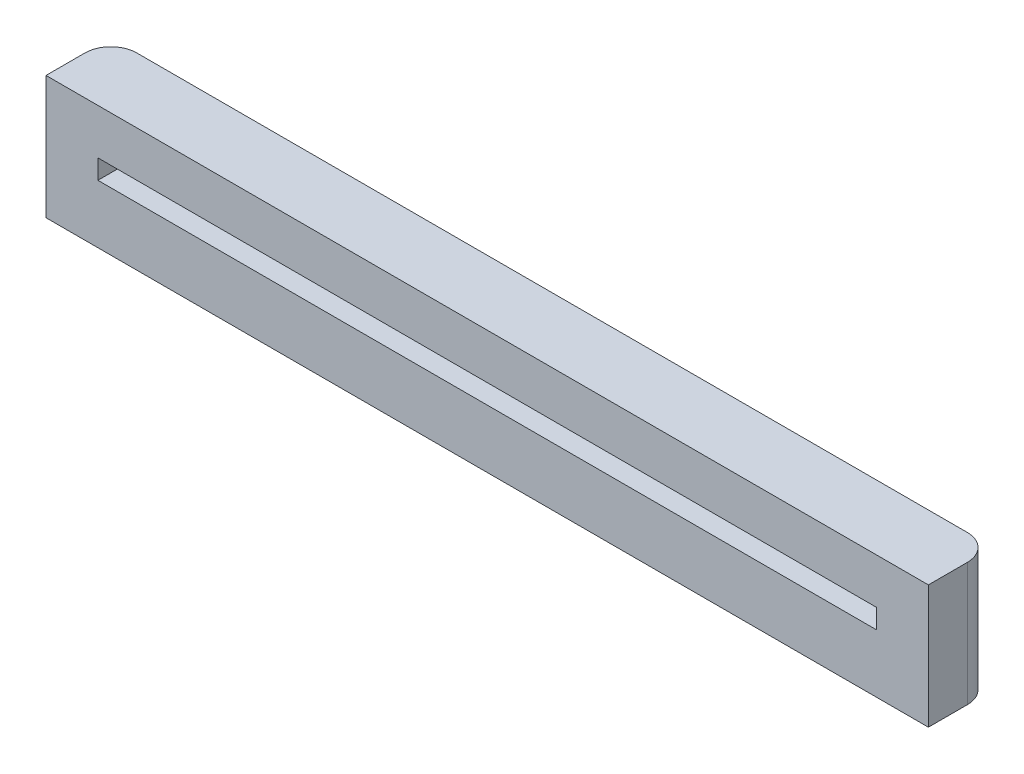
ISO-10303-21;
HEADER;
FILE_DESCRIPTION(('STEP AP214'),'2;1');
FILE_NAME('part.step','',(''),(''),'','','');
FILE_SCHEMA(('AUTOMOTIVE_DESIGN { 1 0 10303 214 1 1 1 1 }'));
ENDSEC;
DATA;
#1=APPLICATION_CONTEXT('core data for automotive mechanical design processes');
#2=APPLICATION_PROTOCOL_DEFINITION('international standard','automotive_design',2000,#1);
#3=PRODUCT_CONTEXT('',#1,'mechanical');
#4=PRODUCT('Part','Part','',(#3));
#5=PRODUCT_RELATED_PRODUCT_CATEGORY('part','',(#4));
#6=PRODUCT_DEFINITION_FORMATION('','',#4);
#7=PRODUCT_DEFINITION_CONTEXT('part definition',#1,'design');
#8=PRODUCT_DEFINITION('design','',#6,#7);
#9=PRODUCT_DEFINITION_SHAPE('','',#8);
#10=(LENGTH_UNIT() NAMED_UNIT(*) SI_UNIT(.MILLI.,.METRE.));
#11=(NAMED_UNIT(*) PLANE_ANGLE_UNIT() SI_UNIT($,.RADIAN.));
#12=(NAMED_UNIT(*) SI_UNIT($,.STERADIAN.) SOLID_ANGLE_UNIT());
#13=UNCERTAINTY_MEASURE_WITH_UNIT(LENGTH_MEASURE(1.E-05),#10,'distance_accuracy_value','');
#14=(GEOMETRIC_REPRESENTATION_CONTEXT(3) GLOBAL_UNCERTAINTY_ASSIGNED_CONTEXT((#13)) GLOBAL_UNIT_ASSIGNED_CONTEXT((#10,
#11,#12)) REPRESENTATION_CONTEXT('',''));
#15=CARTESIAN_POINT('',(0.,0.,0.));
#16=DIRECTION('',(0.,0.,1.));
#17=DIRECTION('',(1.,0.,0.));
#18=AXIS2_PLACEMENT_3D('',#15,#16,#17);
#19=CARTESIAN_POINT('',(0.,0.,5.));
#20=DIRECTION('',(1.,0.,0.));
#21=DIRECTION('',(0.,0.,-1.));
#22=AXIS2_PLACEMENT_3D('',#19,#20,#21);
#23=PLANE('',#22);
#24=DIRECTION('',(0.,0.,-1.));
#25=VECTOR('',#24,1.);
#26=CARTESIAN_POINT('',(0.,9.5,5.));
#27=LINE('',#26,#25);
#28=CARTESIAN_POINT('',(0.,9.5,5.));
#29=VERTEX_POINT('',#28);
#30=CARTESIAN_POINT('',(0.,9.5,2.));
#31=VERTEX_POINT('',#30);
#32=EDGE_CURVE('E168',#29,#31,#27,.T.);
#33=ORIENTED_EDGE('',*,*,#32,.T.);
#34=DIRECTION('',(0.,-1.,0.));
#35=VECTOR('',#34,1.);
#36=CARTESIAN_POINT('',(0.,0.,2.));
#37=LINE('',#36,#35);
#38=CARTESIAN_POINT('',(0.,0.,2.));
#39=VERTEX_POINT('',#38);
#40=EDGE_CURVE('E11',#31,#39,#37,.T.);
#41=ORIENTED_EDGE('',*,*,#40,.T.);
#42=DIRECTION('',(0.,0.,-1.));
#43=VECTOR('',#42,1.);
#44=CARTESIAN_POINT('',(0.,0.,5.));
#45=LINE('',#44,#43);
#46=CARTESIAN_POINT('',(0.,0.,5.));
#47=VERTEX_POINT('',#46);
#48=EDGE_CURVE('E180',#47,#39,#45,.T.);
#49=ORIENTED_EDGE('',*,*,#48,.F.);
#50=DIRECTION('',(0.,-1.,0.));
#51=VECTOR('',#50,1.);
#52=CARTESIAN_POINT('',(0.,0.,5.));
#53=LINE('',#52,#51);
#54=EDGE_CURVE('E158',#29,#47,#53,.T.);
#55=ORIENTED_EDGE('',*,*,#54,.F.);
#56=EDGE_LOOP('',(#33,#41,#49,#55));
#57=FACE_BOUND('',#56,.T.);
#58=ADVANCED_FACE('F36',(#57),#23,.F.);
#59=CARTESIAN_POINT('',(0.,0.,5.));
#60=DIRECTION('',(0.,1.,0.));
#61=DIRECTION('',(0.,0.,1.));
#62=AXIS2_PLACEMENT_3D('',#59,#60,#61);
#63=PLANE('',#62);
#64=DIRECTION('',(1.,0.,0.));
#65=VECTOR('',#64,1.);
#66=CARTESIAN_POINT('',(0.,0.,0.));
#67=LINE('',#66,#65);
#68=CARTESIAN_POINT('',(2.,0.,0.));
#69=VERTEX_POINT('',#68);
#70=CARTESIAN_POINT('',(66.,0.,0.));
#71=VERTEX_POINT('',#70);
#72=EDGE_CURVE('E154',#69,#71,#67,.T.);
#73=ORIENTED_EDGE('',*,*,#72,.T.);
#74=CARTESIAN_POINT('',(66.,0.,2.));
#75=DIRECTION('',(0.,1.,0.));
#76=DIRECTION('',(0.,0.,1.));
#77=AXIS2_PLACEMENT_3D('',#74,#75,#76);
#78=CIRCLE('',#77,2.);
#79=CARTESIAN_POINT('',(68.,0.,2.));
#80=VERTEX_POINT('',#79);
#81=EDGE_CURVE('E44',#71,#80,#78,.F.);
#82=ORIENTED_EDGE('',*,*,#81,.T.);
#83=DIRECTION('',(0.,0.,-1.));
#84=VECTOR('',#83,1.);
#85=CARTESIAN_POINT('',(68.,0.,5.));
#86=LINE('',#85,#84);
#87=CARTESIAN_POINT('',(68.,0.,5.));
#88=VERTEX_POINT('',#87);
#89=EDGE_CURVE('E177',#88,#80,#86,.T.);
#90=ORIENTED_EDGE('',*,*,#89,.F.);
#91=DIRECTION('',(1.,0.,0.));
#92=VECTOR('',#91,1.);
#93=CARTESIAN_POINT('',(0.,0.,5.));
#94=LINE('',#93,#92);
#95=EDGE_CURVE('E161',#47,#88,#94,.T.);
#96=ORIENTED_EDGE('',*,*,#95,.F.);
#97=ORIENTED_EDGE('',*,*,#48,.T.);
#98=CARTESIAN_POINT('',(2.,0.,2.));
#99=DIRECTION('',(0.,1.,0.));
#100=DIRECTION('',(0.,0.,1.));
#101=AXIS2_PLACEMENT_3D('',#98,#99,#100);
#102=CIRCLE('',#101,2.);
#103=EDGE_CURVE('E51',#39,#69,#102,.F.);
#104=ORIENTED_EDGE('',*,*,#103,.T.);
#105=EDGE_LOOP('',(#73,#82,#90,#96,#97,#104));
#106=FACE_BOUND('',#105,.T.);
#107=ADVANCED_FACE('F196',(#106),#63,.F.);
#108=CARTESIAN_POINT('',(68.,0.,5.));
#109=DIRECTION('',(-1.,0.,0.));
#110=DIRECTION('',(0.,0.,1.));
#111=AXIS2_PLACEMENT_3D('',#108,#109,#110);
#112=PLANE('',#111);
#113=ORIENTED_EDGE('',*,*,#89,.T.);
#114=DIRECTION('',(0.,1.,0.));
#115=VECTOR('',#114,1.);
#116=CARTESIAN_POINT('',(68.,9.5,2.));
#117=LINE('',#116,#115);
#118=CARTESIAN_POINT('',(68.,9.5,2.));
#119=VERTEX_POINT('',#118);
#120=EDGE_CURVE('E183',#80,#119,#117,.T.);
#121=ORIENTED_EDGE('',*,*,#120,.T.);
#122=DIRECTION('',(0.,0.,-1.));
#123=VECTOR('',#122,1.);
#124=CARTESIAN_POINT('',(68.,9.5,5.));
#125=LINE('',#124,#123);
#126=CARTESIAN_POINT('',(68.,9.5,5.));
#127=VERTEX_POINT('',#126);
#128=EDGE_CURVE('E174',#127,#119,#125,.T.);
#129=ORIENTED_EDGE('',*,*,#128,.F.);
#130=DIRECTION('',(0.,1.,0.));
#131=VECTOR('',#130,1.);
#132=CARTESIAN_POINT('',(68.,0.,5.));
#133=LINE('',#132,#131);
#134=EDGE_CURVE('E164',#88,#127,#133,.T.);
#135=ORIENTED_EDGE('',*,*,#134,.F.);
#136=EDGE_LOOP('',(#113,#121,#129,#135));
#137=FACE_BOUND('',#136,.T.);
#138=ADVANCED_FACE('F201',(#137),#112,.F.);
#139=CARTESIAN_POINT('',(0.,9.5,5.));
#140=DIRECTION('',(0.,-1.,0.));
#141=DIRECTION('',(0.,0.,-1.));
#142=AXIS2_PLACEMENT_3D('',#139,#140,#141);
#143=PLANE('',#142);
#144=ORIENTED_EDGE('',*,*,#128,.T.);
#145=CARTESIAN_POINT('',(66.,9.5,2.));
#146=DIRECTION('',(0.,-1.,0.));
#147=DIRECTION('',(0.,0.,-1.));
#148=AXIS2_PLACEMENT_3D('',#145,#146,#147);
#149=CIRCLE('',#148,2.);
#150=CARTESIAN_POINT('',(66.,9.5,0.));
#151=VERTEX_POINT('',#150);
#152=EDGE_CURVE('E188',#119,#151,#149,.F.);
#153=ORIENTED_EDGE('',*,*,#152,.T.);
#154=DIRECTION('',(-1.,0.,0.));
#155=VECTOR('',#154,1.);
#156=CARTESIAN_POINT('',(0.,9.5,0.));
#157=LINE('',#156,#155);
#158=CARTESIAN_POINT('',(2.,9.5,0.));
#159=VERTEX_POINT('',#158);
#160=EDGE_CURVE('E162',#151,#159,#157,.T.);
#161=ORIENTED_EDGE('',*,*,#160,.T.);
#162=CARTESIAN_POINT('',(2.,9.5,2.));
#163=DIRECTION('',(0.,-1.,0.));
#164=DIRECTION('',(0.,0.,-1.));
#165=AXIS2_PLACEMENT_3D('',#162,#163,#164);
#166=CIRCLE('',#165,2.);
#167=EDGE_CURVE('E186',#159,#31,#166,.F.);
#168=ORIENTED_EDGE('',*,*,#167,.T.);
#169=ORIENTED_EDGE('',*,*,#32,.F.);
#170=DIRECTION('',(-1.,0.,0.));
#171=VECTOR('',#170,1.);
#172=CARTESIAN_POINT('',(0.,9.5,5.));
#173=LINE('',#172,#171);
#174=EDGE_CURVE('E166',#127,#29,#173,.T.);
#175=ORIENTED_EDGE('',*,*,#174,.F.);
#176=EDGE_LOOP('',(#144,#153,#161,#168,#169,#175));
#177=FACE_BOUND('',#176,.T.);
#178=ADVANCED_FACE('F205',(#177),#143,.F.);
#179=CARTESIAN_POINT('',(0.,0.,5.));
#180=DIRECTION('',(0.,0.,-1.));
#181=DIRECTION('',(-1.,0.,0.));
#182=AXIS2_PLACEMENT_3D('',#179,#180,#181);
#183=PLANE('',#182);
#184=DIRECTION('',(1.,0.,0.));
#185=VECTOR('',#184,1.);
#186=CARTESIAN_POINT('',(4.,4.5,5.));
#187=LINE('',#186,#185);
#188=CARTESIAN_POINT('',(4.,4.5,5.));
#189=VERTEX_POINT('',#188);
#190=CARTESIAN_POINT('',(64.,4.5,5.));
#191=VERTEX_POINT('',#190);
#192=EDGE_CURVE('E148',#189,#191,#187,.T.);
#193=ORIENTED_EDGE('',*,*,#192,.F.);
#194=DIRECTION('',(0.,-1.,0.));
#195=VECTOR('',#194,1.);
#196=CARTESIAN_POINT('',(4.,6.,5.));
#197=LINE('',#196,#195);
#198=CARTESIAN_POINT('',(4.,6.,5.));
#199=VERTEX_POINT('',#198);
#200=EDGE_CURVE('E122',#199,#189,#197,.T.);
#201=ORIENTED_EDGE('',*,*,#200,.F.);
#202=DIRECTION('',(-1.,0.,0.));
#203=VECTOR('',#202,1.);
#204=CARTESIAN_POINT('',(4.,6.,5.));
#205=LINE('',#204,#203);
#206=CARTESIAN_POINT('',(64.,6.,5.));
#207=VERTEX_POINT('',#206);
#208=EDGE_CURVE('E139',#207,#199,#205,.T.);
#209=ORIENTED_EDGE('',*,*,#208,.F.);
#210=DIRECTION('',(0.,1.,0.));
#211=VECTOR('',#210,1.);
#212=CARTESIAN_POINT('',(64.,6.,5.));
#213=LINE('',#212,#211);
#214=EDGE_CURVE('E142',#191,#207,#213,.T.);
#215=ORIENTED_EDGE('',*,*,#214,.F.);
#216=EDGE_LOOP('',(#193,#201,#209,#215));
#217=FACE_BOUND('',#216,.T.);
#218=ORIENTED_EDGE('',*,*,#54,.T.);
#219=ORIENTED_EDGE('',*,*,#95,.T.);
#220=ORIENTED_EDGE('',*,*,#134,.T.);
#221=ORIENTED_EDGE('',*,*,#174,.T.);
#222=EDGE_LOOP('',(#218,#219,#220,#221));
#223=FACE_BOUND('',#222,.T.);
#224=ADVANCED_FACE('F214',(#217,#223),#183,.F.);
#225=CARTESIAN_POINT('',(0.,0.,0.));
#226=DIRECTION('',(0.,0.,-1.));
#227=DIRECTION('',(-1.,0.,0.));
#228=AXIS2_PLACEMENT_3D('',#225,#226,#227);
#229=PLANE('',#228);
#230=ORIENTED_EDGE('',*,*,#160,.F.);
#231=DIRECTION('',(0.,1.,0.));
#232=VECTOR('',#231,1.);
#233=CARTESIAN_POINT('',(66.,0.,0.));
#234=LINE('',#233,#232);
#235=EDGE_CURVE('E58',#151,#71,#234,.F.);
#236=ORIENTED_EDGE('',*,*,#235,.T.);
#237=ORIENTED_EDGE('',*,*,#72,.F.);
#238=DIRECTION('',(0.,-1.,0.));
#239=VECTOR('',#238,1.);
#240=CARTESIAN_POINT('',(2.,9.5,0.));
#241=LINE('',#240,#239);
#242=EDGE_CURVE('E190',#69,#159,#241,.F.);
#243=ORIENTED_EDGE('',*,*,#242,.T.);
#244=EDGE_LOOP('',(#230,#236,#237,#243));
#245=FACE_BOUND('',#244,.T.);
#246=ADVANCED_FACE('F208',(#245),#229,.T.);
#247=CARTESIAN_POINT('',(4.,6.,2.));
#248=DIRECTION('',(-1.,0.,0.));
#249=DIRECTION('',(0.,0.,1.));
#250=AXIS2_PLACEMENT_3D('',#247,#248,#249);
#251=PLANE('',#250);
#252=ORIENTED_EDGE('',*,*,#200,.T.);
#253=DIRECTION('',(0.,0.,1.));
#254=VECTOR('',#253,1.);
#255=CARTESIAN_POINT('',(4.,4.5,2.));
#256=LINE('',#255,#254);
#257=CARTESIAN_POINT('',(4.,4.5,2.));
#258=VERTEX_POINT('',#257);
#259=EDGE_CURVE('E115',#258,#189,#256,.T.);
#260=ORIENTED_EDGE('',*,*,#259,.F.);
#261=DIRECTION('',(0.,-1.,0.));
#262=VECTOR('',#261,1.);
#263=CARTESIAN_POINT('',(4.,6.,2.));
#264=LINE('',#263,#262);
#265=CARTESIAN_POINT('',(4.,6.,2.));
#266=VERTEX_POINT('',#265);
#267=EDGE_CURVE('E119',#266,#258,#264,.T.);
#268=ORIENTED_EDGE('',*,*,#267,.F.);
#269=DIRECTION('',(0.,0.,1.));
#270=VECTOR('',#269,1.);
#271=CARTESIAN_POINT('',(4.,6.,2.));
#272=LINE('',#271,#270);
#273=EDGE_CURVE('E152',#266,#199,#272,.T.);
#274=ORIENTED_EDGE('',*,*,#273,.T.);
#275=EDGE_LOOP('',(#252,#260,#268,#274));
#276=FACE_BOUND('',#275,.T.);
#277=ADVANCED_FACE('F117',(#276),#251,.F.);
#278=CARTESIAN_POINT('',(4.,6.,2.));
#279=DIRECTION('',(0.,1.,0.));
#280=DIRECTION('',(-1.,0.,0.));
#281=AXIS2_PLACEMENT_3D('',#278,#279,#280);
#282=PLANE('',#281);
#283=ORIENTED_EDGE('',*,*,#208,.T.);
#284=ORIENTED_EDGE('',*,*,#273,.F.);
#285=DIRECTION('',(-1.,0.,0.));
#286=VECTOR('',#285,1.);
#287=CARTESIAN_POINT('',(4.,6.,2.));
#288=LINE('',#287,#286);
#289=CARTESIAN_POINT('',(64.,6.,2.));
#290=VERTEX_POINT('',#289);
#291=EDGE_CURVE('E127',#290,#266,#288,.T.);
#292=ORIENTED_EDGE('',*,*,#291,.F.);
#293=DIRECTION('',(0.,0.,1.));
#294=VECTOR('',#293,1.);
#295=CARTESIAN_POINT('',(64.,6.,2.));
#296=LINE('',#295,#294);
#297=EDGE_CURVE('E155',#290,#207,#296,.T.);
#298=ORIENTED_EDGE('',*,*,#297,.T.);
#299=EDGE_LOOP('',(#283,#284,#292,#298));
#300=FACE_BOUND('',#299,.T.);
#301=ADVANCED_FACE('F244',(#300),#282,.F.);
#302=CARTESIAN_POINT('',(64.,6.,2.));
#303=DIRECTION('',(1.,0.,0.));
#304=DIRECTION('',(0.,0.,-1.));
#305=AXIS2_PLACEMENT_3D('',#302,#303,#304);
#306=PLANE('',#305);
#307=ORIENTED_EDGE('',*,*,#214,.T.);
#308=ORIENTED_EDGE('',*,*,#297,.F.);
#309=DIRECTION('',(0.,1.,0.));
#310=VECTOR('',#309,1.);
#311=CARTESIAN_POINT('',(64.,6.,2.));
#312=LINE('',#311,#310);
#313=CARTESIAN_POINT('',(64.,4.5,2.));
#314=VERTEX_POINT('',#313);
#315=EDGE_CURVE('E135',#314,#290,#312,.T.);
#316=ORIENTED_EDGE('',*,*,#315,.F.);
#317=DIRECTION('',(0.,0.,1.));
#318=VECTOR('',#317,1.);
#319=CARTESIAN_POINT('',(64.,4.5,2.));
#320=LINE('',#319,#318);
#321=EDGE_CURVE('E126',#314,#191,#320,.T.);
#322=ORIENTED_EDGE('',*,*,#321,.T.);
#323=EDGE_LOOP('',(#307,#308,#316,#322));
#324=FACE_BOUND('',#323,.T.);
#325=ADVANCED_FACE('F241',(#324),#306,.F.);
#326=CARTESIAN_POINT('',(4.,4.5,2.));
#327=DIRECTION('',(0.,-1.,0.));
#328=DIRECTION('',(0.,0.,-1.));
#329=AXIS2_PLACEMENT_3D('',#326,#327,#328);
#330=PLANE('',#329);
#331=ORIENTED_EDGE('',*,*,#192,.T.);
#332=ORIENTED_EDGE('',*,*,#321,.F.);
#333=DIRECTION('',(1.,0.,0.));
#334=VECTOR('',#333,1.);
#335=CARTESIAN_POINT('',(4.,4.5,2.));
#336=LINE('',#335,#334);
#337=EDGE_CURVE('E130',#258,#314,#336,.T.);
#338=ORIENTED_EDGE('',*,*,#337,.F.);
#339=ORIENTED_EDGE('',*,*,#259,.T.);
#340=EDGE_LOOP('',(#331,#332,#338,#339));
#341=FACE_BOUND('',#340,.T.);
#342=ADVANCED_FACE('F131',(#341),#330,.F.);
#343=CARTESIAN_POINT('',(0.,0.,2.));
#344=DIRECTION('',(0.,0.,1.));
#345=DIRECTION('',(1.,0.,0.));
#346=AXIS2_PLACEMENT_3D('',#343,#344,#345);
#347=PLANE('',#346);
#348=ORIENTED_EDGE('',*,*,#267,.T.);
#349=ORIENTED_EDGE('',*,*,#337,.T.);
#350=ORIENTED_EDGE('',*,*,#315,.T.);
#351=ORIENTED_EDGE('',*,*,#291,.T.);
#352=EDGE_LOOP('',(#348,#349,#350,#351));
#353=FACE_BOUND('',#352,.T.);
#354=ADVANCED_FACE('F137',(#353),#347,.T.);
#355=CARTESIAN_POINT('',(66.,0.,2.));
#356=DIRECTION('',(0.,-1.,0.));
#357=DIRECTION('',(0.,0.,-1.));
#358=AXIS2_PLACEMENT_3D('',#355,#356,#357);
#359=CYLINDRICAL_SURFACE('',#358,2.);
#360=ORIENTED_EDGE('',*,*,#81,.F.);
#361=ORIENTED_EDGE('',*,*,#235,.F.);
#362=ORIENTED_EDGE('',*,*,#152,.F.);
#363=ORIENTED_EDGE('',*,*,#120,.F.);
#364=EDGE_LOOP('',(#360,#361,#362,#363));
#365=FACE_BOUND('',#364,.T.);
#366=ADVANCED_FACE('F203',(#365),#359,.T.);
#367=CARTESIAN_POINT('',(2.,0.,2.));
#368=DIRECTION('',(0.,1.,0.));
#369=DIRECTION('',(0.,0.,1.));
#370=AXIS2_PLACEMENT_3D('',#367,#368,#369);
#371=CYLINDRICAL_SURFACE('',#370,2.);
#372=ORIENTED_EDGE('',*,*,#167,.F.);
#373=ORIENTED_EDGE('',*,*,#242,.F.);
#374=ORIENTED_EDGE('',*,*,#103,.F.);
#375=ORIENTED_EDGE('',*,*,#40,.F.);
#376=EDGE_LOOP('',(#372,#373,#374,#375));
#377=FACE_BOUND('',#376,.T.);
#378=ADVANCED_FACE('F38',(#377),#371,.T.);
#379=CLOSED_SHELL('',(#58,#107,#138,#178,#224,#246,#277,#301,#325,#342,#354,#366,#378));
#380=MANIFOLD_SOLID_BREP('B2',#379);
#381=ADVANCED_BREP_SHAPE_REPRESENTATION('',(#18,#380),#14);
#382=SHAPE_DEFINITION_REPRESENTATION(#9,#381);
ENDSEC;
END-ISO-10303-21;
